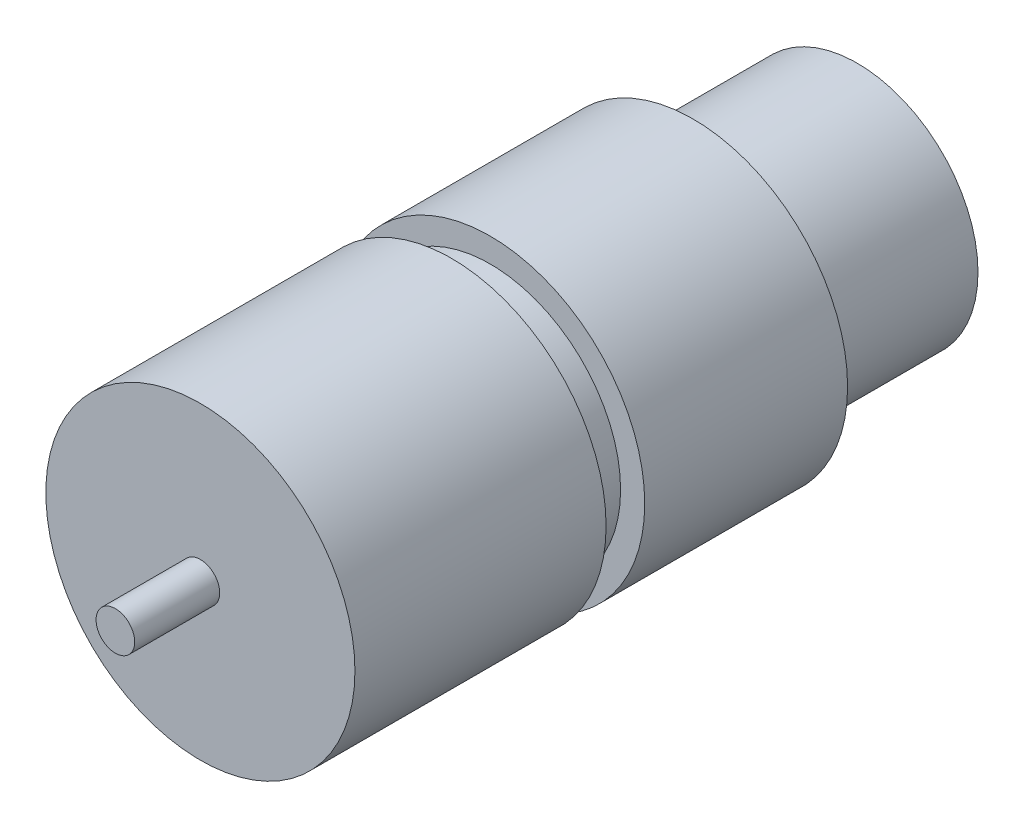
ISO-10303-21;
HEADER;
FILE_DESCRIPTION(('STEP AP214'),'2;1');
FILE_NAME('part.step','',(''),(''),'','','');
FILE_SCHEMA(('AUTOMOTIVE_DESIGN { 1 0 10303 214 1 1 1 1 }'));
ENDSEC;
DATA;
#1=APPLICATION_CONTEXT('core data for automotive mechanical design processes');
#2=APPLICATION_PROTOCOL_DEFINITION('international standard','automotive_design',2000,#1);
#3=PRODUCT_CONTEXT('',#1,'mechanical');
#4=PRODUCT('Part','Part','',(#3));
#5=PRODUCT_RELATED_PRODUCT_CATEGORY('part','',(#4));
#6=PRODUCT_DEFINITION_FORMATION('','',#4);
#7=PRODUCT_DEFINITION_CONTEXT('part definition',#1,'design');
#8=PRODUCT_DEFINITION('design','',#6,#7);
#9=PRODUCT_DEFINITION_SHAPE('','',#8);
#10=(LENGTH_UNIT() NAMED_UNIT(*) SI_UNIT(.MILLI.,.METRE.));
#11=(NAMED_UNIT(*) PLANE_ANGLE_UNIT() SI_UNIT($,.RADIAN.));
#12=(NAMED_UNIT(*) SI_UNIT($,.STERADIAN.) SOLID_ANGLE_UNIT());
#13=UNCERTAINTY_MEASURE_WITH_UNIT(LENGTH_MEASURE(1.E-05),#10,'distance_accuracy_value','');
#14=(GEOMETRIC_REPRESENTATION_CONTEXT(3) GLOBAL_UNCERTAINTY_ASSIGNED_CONTEXT((#13)) GLOBAL_UNIT_ASSIGNED_CONTEXT((#10,
#11,#12)) REPRESENTATION_CONTEXT('',''));
#15=CARTESIAN_POINT('',(0.,0.,0.));
#16=DIRECTION('',(0.,0.,1.));
#17=DIRECTION('',(1.,0.,0.));
#18=AXIS2_PLACEMENT_3D('',#15,#16,#17);
#19=CARTESIAN_POINT('',(0.,0.,68.));
#20=DIRECTION('',(0.,0.,1.));
#21=DIRECTION('',(1.,0.,0.));
#22=AXIS2_PLACEMENT_3D('',#19,#20,#21);
#23=PLANE('',#22);
#24=CARTESIAN_POINT('',(0.,0.,68.));
#25=DIRECTION('',(0.,0.,1.));
#26=DIRECTION('',(1.,0.,0.));
#27=AXIS2_PLACEMENT_3D('',#24,#25,#26);
#28=CIRCLE('',#27,16.);
#29=CARTESIAN_POINT('',(16.,0.,68.));
#30=VERTEX_POINT('',#29);
#31=EDGE_CURVE('E45',#30,#30,#28,.T.);
#32=ORIENTED_EDGE('',*,*,#31,.T.);
#33=EDGE_LOOP('',(#32));
#34=FACE_BOUND('',#33,.T.);
#35=CARTESIAN_POINT('',(0.,0.,68.));
#36=DIRECTION('',(0.,0.,1.));
#37=DIRECTION('',(1.,0.,0.));
#38=AXIS2_PLACEMENT_3D('',#35,#36,#37);
#39=CIRCLE('',#38,2.);
#40=CARTESIAN_POINT('',(2.,0.,68.));
#41=VERTEX_POINT('',#40);
#42=EDGE_CURVE('E56',#41,#41,#39,.T.);
#43=ORIENTED_EDGE('',*,*,#42,.F.);
#44=EDGE_LOOP('',(#43));
#45=FACE_BOUND('',#44,.T.);
#46=ADVANCED_FACE('F32',(#34,#45),#23,.T.);
#47=CARTESIAN_POINT('',(0.,0.,68.));
#48=DIRECTION('',(0.,0.,-1.));
#49=DIRECTION('',(-1.,0.,0.));
#50=AXIS2_PLACEMENT_3D('',#47,#48,#49);
#51=CYLINDRICAL_SURFACE('',#50,16.);
#52=CARTESIAN_POINT('',(0.,0.,42.));
#53=DIRECTION('',(0.,0.,1.));
#54=DIRECTION('',(1.,0.,0.));
#55=AXIS2_PLACEMENT_3D('',#52,#53,#54);
#56=CIRCLE('',#55,16.);
#57=CARTESIAN_POINT('',(16.,0.,42.));
#58=VERTEX_POINT('',#57);
#59=EDGE_CURVE('E36',#58,#58,#56,.T.);
#60=ORIENTED_EDGE('',*,*,#59,.T.);
#61=EDGE_LOOP('',(#60));
#62=FACE_BOUND('',#61,.T.);
#63=ORIENTED_EDGE('',*,*,#31,.F.);
#64=EDGE_LOOP('',(#63));
#65=FACE_BOUND('',#64,.T.);
#66=ADVANCED_FACE('F86',(#62,#65),#51,.T.);
#67=CARTESIAN_POINT('',(0.,0.,76.8));
#68=DIRECTION('',(0.,0.,-1.));
#69=DIRECTION('',(-1.,0.,0.));
#70=AXIS2_PLACEMENT_3D('',#67,#68,#69);
#71=CYLINDRICAL_SURFACE('',#70,2.);
#72=CARTESIAN_POINT('',(0.,0.,76.8));
#73=DIRECTION('',(0.,0.,1.));
#74=DIRECTION('',(1.,0.,0.));
#75=AXIS2_PLACEMENT_3D('',#72,#73,#74);
#76=CIRCLE('',#75,2.);
#77=CARTESIAN_POINT('',(2.,0.,76.8));
#78=VERTEX_POINT('',#77);
#79=EDGE_CURVE('E65',#78,#78,#76,.T.);
#80=ORIENTED_EDGE('',*,*,#79,.F.);
#81=EDGE_LOOP('',(#80));
#82=FACE_BOUND('',#81,.T.);
#83=ORIENTED_EDGE('',*,*,#42,.T.);
#84=EDGE_LOOP('',(#83));
#85=FACE_BOUND('',#84,.T.);
#86=ADVANCED_FACE('F94',(#82,#85),#71,.T.);
#87=CARTESIAN_POINT('',(0.,0.,76.8));
#88=DIRECTION('',(0.,0.,1.));
#89=DIRECTION('',(1.,0.,0.));
#90=AXIS2_PLACEMENT_3D('',#87,#88,#89);
#91=PLANE('',#90);
#92=ORIENTED_EDGE('',*,*,#79,.T.);
#93=EDGE_LOOP('',(#92));
#94=FACE_BOUND('',#93,.T.);
#95=ADVANCED_FACE('F100',(#94),#91,.T.);
#96=CARTESIAN_POINT('',(0.,0.,42.));
#97=DIRECTION('',(0.,0.,1.));
#98=DIRECTION('',(1.,0.,0.));
#99=AXIS2_PLACEMENT_3D('',#96,#97,#98);
#100=PLANE('',#99);
#101=CARTESIAN_POINT('',(0.,0.,42.));
#102=DIRECTION('',(0.,0.,1.));
#103=DIRECTION('',(1.,0.,0.));
#104=AXIS2_PLACEMENT_3D('',#101,#102,#103);
#105=CIRCLE('',#104,13.5);
#106=CARTESIAN_POINT('',(13.5,0.,42.));
#107=VERTEX_POINT('',#106);
#108=EDGE_CURVE('E52',#107,#107,#105,.T.);
#109=ORIENTED_EDGE('',*,*,#108,.T.);
#110=EDGE_LOOP('',(#109));
#111=FACE_BOUND('',#110,.T.);
#112=ORIENTED_EDGE('',*,*,#59,.F.);
#113=EDGE_LOOP('',(#112));
#114=FACE_BOUND('',#113,.T.);
#115=ADVANCED_FACE('F104',(#111,#114),#100,.F.);
#116=CARTESIAN_POINT('',(0.,0.,38.));
#117=DIRECTION('',(0.,0.,1.));
#118=DIRECTION('',(1.,0.,0.));
#119=AXIS2_PLACEMENT_3D('',#116,#117,#118);
#120=PLANE('',#119);
#121=CARTESIAN_POINT('',(0.,0.,38.));
#122=DIRECTION('',(0.,0.,1.));
#123=DIRECTION('',(1.,0.,0.));
#124=AXIS2_PLACEMENT_3D('',#121,#122,#123);
#125=CIRCLE('',#124,13.5);
#126=CARTESIAN_POINT('',(13.5,0.,38.));
#127=VERTEX_POINT('',#126);
#128=EDGE_CURVE('E58',#127,#127,#125,.T.);
#129=ORIENTED_EDGE('',*,*,#128,.F.);
#130=EDGE_LOOP('',(#129));
#131=FACE_BOUND('',#130,.T.);
#132=CARTESIAN_POINT('',(0.,0.,38.));
#133=DIRECTION('',(0.,0.,1.));
#134=DIRECTION('',(1.,0.,0.));
#135=AXIS2_PLACEMENT_3D('',#132,#133,#134);
#136=CIRCLE('',#135,16.);
#137=CARTESIAN_POINT('',(16.,0.,38.));
#138=VERTEX_POINT('',#137);
#139=EDGE_CURVE('E50',#138,#138,#136,.T.);
#140=ORIENTED_EDGE('',*,*,#139,.T.);
#141=EDGE_LOOP('',(#140));
#142=FACE_BOUND('',#141,.T.);
#143=ADVANCED_FACE('F106',(#131,#142),#120,.T.);
#144=CARTESIAN_POINT('',(0.,0.,42.));
#145=DIRECTION('',(0.,0.,-1.));
#146=DIRECTION('',(-1.,0.,0.));
#147=AXIS2_PLACEMENT_3D('',#144,#145,#146);
#148=CYLINDRICAL_SURFACE('',#147,13.5);
#149=ORIENTED_EDGE('',*,*,#108,.F.);
#150=EDGE_LOOP('',(#149));
#151=FACE_BOUND('',#150,.T.);
#152=ORIENTED_EDGE('',*,*,#128,.T.);
#153=EDGE_LOOP('',(#152));
#154=FACE_BOUND('',#153,.T.);
#155=ADVANCED_FACE('F109',(#151,#154),#148,.T.);
#156=CARTESIAN_POINT('',(0.,0.,0.));
#157=DIRECTION('',(0.,0.,1.));
#158=DIRECTION('',(1.,0.,0.));
#159=AXIS2_PLACEMENT_3D('',#156,#157,#158);
#160=PLANE('',#159);
#161=CARTESIAN_POINT('',(0.,0.,0.));
#162=DIRECTION('',(0.,0.,1.));
#163=DIRECTION('',(1.,0.,0.));
#164=AXIS2_PLACEMENT_3D('',#161,#162,#163);
#165=CIRCLE('',#164,12.5);
#166=CARTESIAN_POINT('',(12.5,0.,0.));
#167=VERTEX_POINT('',#166);
#168=EDGE_CURVE('E40',#167,#167,#165,.T.);
#169=ORIENTED_EDGE('',*,*,#168,.F.);
#170=EDGE_LOOP('',(#169));
#171=FACE_BOUND('',#170,.T.);
#172=ADVANCED_FACE('F87',(#171),#160,.F.);
#173=CARTESIAN_POINT('',(0.,0.,17.));
#174=DIRECTION('',(0.,0.,-1.));
#175=DIRECTION('',(-1.,0.,0.));
#176=AXIS2_PLACEMENT_3D('',#173,#174,#175);
#177=CYLINDRICAL_SURFACE('',#176,12.5);
#178=CARTESIAN_POINT('',(0.,0.,17.));
#179=DIRECTION('',(0.,0.,1.));
#180=DIRECTION('',(1.,0.,0.));
#181=AXIS2_PLACEMENT_3D('',#178,#179,#180);
#182=CIRCLE('',#181,12.5);
#183=CARTESIAN_POINT('',(12.5,0.,17.));
#184=VERTEX_POINT('',#183);
#185=EDGE_CURVE('E10',#184,#184,#182,.T.);
#186=ORIENTED_EDGE('',*,*,#185,.F.);
#187=EDGE_LOOP('',(#186));
#188=FACE_BOUND('',#187,.T.);
#189=ORIENTED_EDGE('',*,*,#168,.T.);
#190=EDGE_LOOP('',(#189));
#191=FACE_BOUND('',#190,.T.);
#192=ADVANCED_FACE('F34',(#188,#191),#177,.T.);
#193=CARTESIAN_POINT('',(0.,0.,17.));
#194=DIRECTION('',(0.,0.,1.));
#195=DIRECTION('',(1.,0.,0.));
#196=AXIS2_PLACEMENT_3D('',#193,#194,#195);
#197=PLANE('',#196);
#198=CARTESIAN_POINT('',(0.,0.,17.));
#199=DIRECTION('',(0.,0.,1.));
#200=DIRECTION('',(1.,0.,0.));
#201=AXIS2_PLACEMENT_3D('',#198,#199,#200);
#202=CIRCLE('',#201,16.);
#203=CARTESIAN_POINT('',(16.,0.,17.));
#204=VERTEX_POINT('',#203);
#205=EDGE_CURVE('E48',#204,#204,#202,.T.);
#206=ORIENTED_EDGE('',*,*,#205,.F.);
#207=EDGE_LOOP('',(#206));
#208=FACE_BOUND('',#207,.T.);
#209=ORIENTED_EDGE('',*,*,#185,.T.);
#210=EDGE_LOOP('',(#209));
#211=FACE_BOUND('',#210,.T.);
#212=ADVANCED_FACE('F78',(#208,#211),#197,.F.);
#213=ORIENTED_EDGE('',*,*,#205,.T.);
#214=EDGE_LOOP('',(#213));
#215=FACE_BOUND('',#214,.T.);
#216=ORIENTED_EDGE('',*,*,#139,.F.);
#217=EDGE_LOOP('',(#216));
#218=FACE_BOUND('',#217,.T.);
#219=ADVANCED_FACE('F75',(#215,#218),#51,.T.);
#220=CLOSED_SHELL('',(#46,#66,#86,#95,#115,#143,#155,#172,#192,#212,#219));
#221=MANIFOLD_SOLID_BREP('B2',#220);
#222=ADVANCED_BREP_SHAPE_REPRESENTATION('',(#18,#221),#14);
#223=SHAPE_DEFINITION_REPRESENTATION(#9,#222);
ENDSEC;
END-ISO-10303-21;
